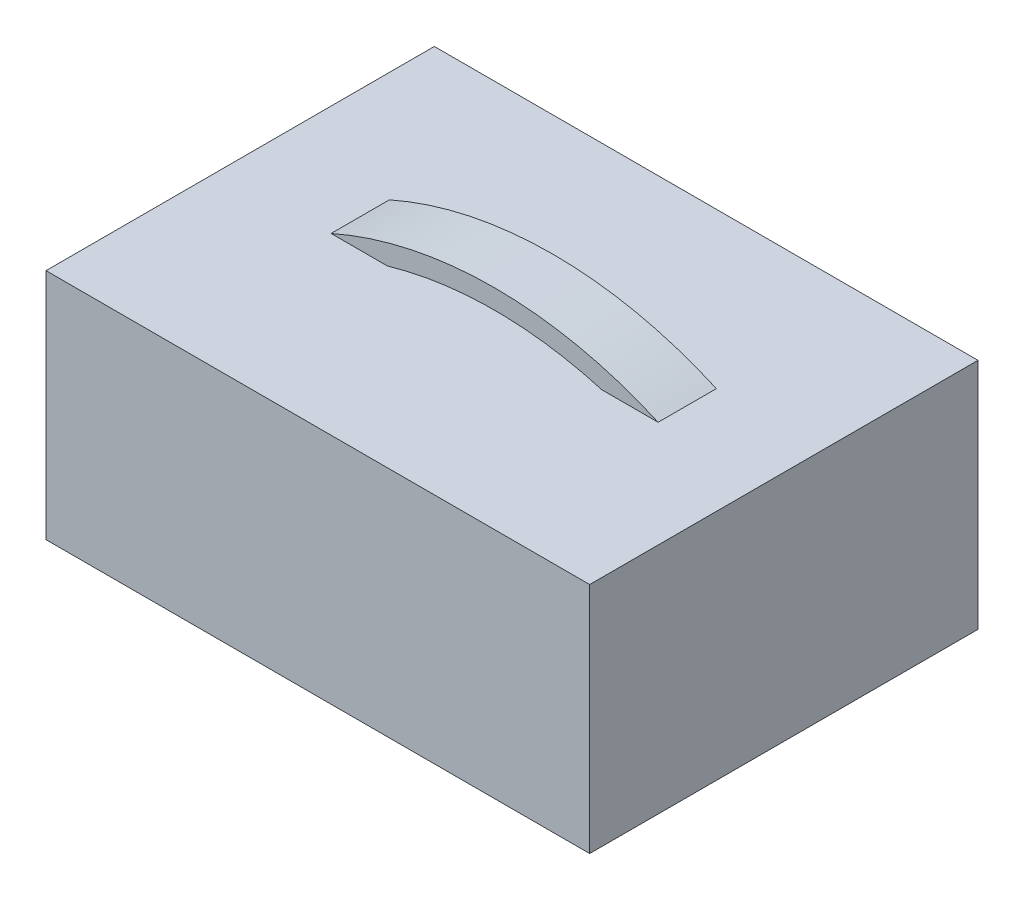
ISO-10303-21;
HEADER;
FILE_DESCRIPTION(('STEP AP214'),'2;1');
FILE_NAME('part.step','',(''),(''),'','','');
FILE_SCHEMA(('AUTOMOTIVE_DESIGN { 1 0 10303 214 1 1 1 1 }'));
ENDSEC;
DATA;
#1=APPLICATION_CONTEXT('core data for automotive mechanical design processes');
#2=APPLICATION_PROTOCOL_DEFINITION('international standard','automotive_design',2000,#1);
#3=PRODUCT_CONTEXT('',#1,'mechanical');
#4=PRODUCT('Part','Part','',(#3));
#5=PRODUCT_RELATED_PRODUCT_CATEGORY('part','',(#4));
#6=PRODUCT_DEFINITION_FORMATION('','',#4);
#7=PRODUCT_DEFINITION_CONTEXT('part definition',#1,'design');
#8=PRODUCT_DEFINITION('design','',#6,#7);
#9=PRODUCT_DEFINITION_SHAPE('','',#8);
#10=(LENGTH_UNIT() NAMED_UNIT(*) SI_UNIT(.MILLI.,.METRE.));
#11=(NAMED_UNIT(*) PLANE_ANGLE_UNIT() SI_UNIT($,.RADIAN.));
#12=(NAMED_UNIT(*) SI_UNIT($,.STERADIAN.) SOLID_ANGLE_UNIT());
#13=UNCERTAINTY_MEASURE_WITH_UNIT(LENGTH_MEASURE(1.E-05),#10,'distance_accuracy_value','');
#14=(GEOMETRIC_REPRESENTATION_CONTEXT(3) GLOBAL_UNCERTAINTY_ASSIGNED_CONTEXT((#13)) GLOBAL_UNIT_ASSIGNED_CONTEXT((#10,
#11,#12)) REPRESENTATION_CONTEXT('',''));
#15=CARTESIAN_POINT('',(0.,0.,0.));
#16=DIRECTION('',(0.,0.,1.));
#17=DIRECTION('',(1.,0.,0.));
#18=AXIS2_PLACEMENT_3D('',#15,#16,#17);
#19=CARTESIAN_POINT('',(0.,120.,0.));
#20=DIRECTION('',(0.,-1.,0.));
#21=DIRECTION('',(0.,0.,-1.));
#22=AXIS2_PLACEMENT_3D('',#19,#20,#21);
#23=PLANE('',#22);
#24=DIRECTION('',(-1.,0.,0.));
#25=VECTOR('',#24,1.);
#26=CARTESIAN_POINT('',(0.,120.,-120.));
#27=LINE('',#26,#25);
#28=CARTESIAN_POINT('',(85.865413905169,120.,-120.));
#29=VERTEX_POINT('',#28);
#30=CARTESIAN_POINT('',(56.8404748659782,120.,-120.));
#31=VERTEX_POINT('',#30);
#32=EDGE_CURVE('E42',#29,#31,#27,.T.);
#33=ORIENTED_EDGE('',*,*,#32,.F.);
#34=DIRECTION('',(0.,0.,1.));
#35=VECTOR('',#34,1.);
#36=CARTESIAN_POINT('',(85.865413905169,120.,-120.));
#37=LINE('',#36,#35);
#38=CARTESIAN_POINT('',(85.865413905169,120.,-90.));
#39=VERTEX_POINT('',#38);
#40=EDGE_CURVE('E119',#29,#39,#37,.T.);
#41=ORIENTED_EDGE('',*,*,#40,.T.);
#42=DIRECTION('',(-1.,0.,0.));
#43=VECTOR('',#42,1.);
#44=CARTESIAN_POINT('',(0.,120.,-90.));
#45=LINE('',#44,#43);
#46=CARTESIAN_POINT('',(56.8404748659782,120.,-90.));
#47=VERTEX_POINT('',#46);
#48=EDGE_CURVE('E118',#39,#47,#45,.T.);
#49=ORIENTED_EDGE('',*,*,#48,.T.);
#50=DIRECTION('',(0.,0.,1.));
#51=VECTOR('',#50,1.);
#52=CARTESIAN_POINT('',(56.8404748659782,120.,-120.));
#53=LINE('',#52,#51);
#54=EDGE_CURVE('E112',#31,#47,#53,.T.);
#55=ORIENTED_EDGE('',*,*,#54,.F.);
#56=EDGE_LOOP('',(#33,#41,#49,#55));
#57=FACE_BOUND('',#56,.T.);
#58=DIRECTION('',(0.,0.,1.));
#59=VECTOR('',#58,1.);
#60=CARTESIAN_POINT('',(0.,120.,0.));
#61=LINE('',#60,#59);
#62=CARTESIAN_POINT('',(0.,120.,-200.));
#63=VERTEX_POINT('',#62);
#64=CARTESIAN_POINT('',(0.,120.,0.));
#65=VERTEX_POINT('',#64);
#66=EDGE_CURVE('E143',#63,#65,#61,.T.);
#67=ORIENTED_EDGE('',*,*,#66,.T.);
#68=DIRECTION('',(1.,0.,0.));
#69=VECTOR('',#68,1.);
#70=CARTESIAN_POINT('',(0.,120.,0.));
#71=LINE('',#70,#69);
#72=CARTESIAN_POINT('',(280.,120.,0.));
#73=VERTEX_POINT('',#72);
#74=EDGE_CURVE('E153',#65,#73,#71,.T.);
#75=ORIENTED_EDGE('',*,*,#74,.T.);
#76=DIRECTION('',(0.,0.,-1.));
#77=VECTOR('',#76,1.);
#78=CARTESIAN_POINT('',(280.,120.,0.));
#79=LINE('',#78,#77);
#80=CARTESIAN_POINT('',(280.,120.,-200.));
#81=VERTEX_POINT('',#80);
#82=EDGE_CURVE('E151',#73,#81,#79,.T.);
#83=ORIENTED_EDGE('',*,*,#82,.T.);
#84=DIRECTION('',(-1.,0.,0.));
#85=VECTOR('',#84,1.);
#86=CARTESIAN_POINT('',(0.,120.,-200.));
#87=LINE('',#86,#85);
#88=EDGE_CURVE('E140',#81,#63,#87,.T.);
#89=ORIENTED_EDGE('',*,*,#88,.T.);
#90=EDGE_LOOP('',(#67,#75,#83,#89));
#91=FACE_BOUND('',#90,.T.);
#92=CARTESIAN_POINT('',(225.25719537895,120.,-120.));
#93=VERTEX_POINT('',#92);
#94=CARTESIAN_POINT('',(196.232256339759,120.,-120.));
#95=VERTEX_POINT('',#94);
#96=EDGE_CURVE('E11',#93,#95,#27,.T.);
#97=ORIENTED_EDGE('',*,*,#96,.F.);
#98=DIRECTION('',(0.,0.,1.));
#99=VECTOR('',#98,1.);
#100=CARTESIAN_POINT('',(225.25719537895,120.,-120.));
#101=LINE('',#100,#99);
#102=CARTESIAN_POINT('',(225.25719537895,120.,-90.));
#103=VERTEX_POINT('',#102);
#104=EDGE_CURVE('E105',#93,#103,#101,.T.);
#105=ORIENTED_EDGE('',*,*,#104,.T.);
#106=CARTESIAN_POINT('',(196.232256339759,120.,-90.));
#107=VERTEX_POINT('',#106);
#108=EDGE_CURVE('E115',#103,#107,#45,.T.);
#109=ORIENTED_EDGE('',*,*,#108,.T.);
#110=DIRECTION('',(0.,0.,1.));
#111=VECTOR('',#110,1.);
#112=CARTESIAN_POINT('',(196.232256339759,120.,-120.));
#113=LINE('',#112,#111);
#114=EDGE_CURVE('E37',#107,#95,#113,.F.);
#115=ORIENTED_EDGE('',*,*,#114,.T.);
#116=EDGE_LOOP('',(#97,#105,#109,#115));
#117=FACE_BOUND('',#116,.T.);
#118=ADVANCED_FACE('F33',(#57,#91,#117),#23,.F.);
#119=CARTESIAN_POINT('',(0.,120.,0.));
#120=DIRECTION('',(1.,0.,0.));
#121=DIRECTION('',(0.,0.,-1.));
#122=AXIS2_PLACEMENT_3D('',#119,#120,#121);
#123=PLANE('',#122);
#124=DIRECTION('',(0.,0.,1.));
#125=VECTOR('',#124,1.);
#126=CARTESIAN_POINT('',(0.,0.,0.));
#127=LINE('',#126,#125);
#128=CARTESIAN_POINT('',(0.,0.,-200.));
#129=VERTEX_POINT('',#128);
#130=CARTESIAN_POINT('',(0.,0.,0.));
#131=VERTEX_POINT('',#130);
#132=EDGE_CURVE('E148',#129,#131,#127,.T.);
#133=ORIENTED_EDGE('',*,*,#132,.T.);
#134=DIRECTION('',(0.,-1.,0.));
#135=VECTOR('',#134,1.);
#136=CARTESIAN_POINT('',(0.,120.,0.));
#137=LINE('',#136,#135);
#138=EDGE_CURVE('E123',#65,#131,#137,.T.);
#139=ORIENTED_EDGE('',*,*,#138,.F.);
#140=ORIENTED_EDGE('',*,*,#66,.F.);
#141=DIRECTION('',(0.,-1.,0.));
#142=VECTOR('',#141,1.);
#143=CARTESIAN_POINT('',(0.,120.,-200.));
#144=LINE('',#143,#142);
#145=EDGE_CURVE('E137',#63,#129,#144,.T.);
#146=ORIENTED_EDGE('',*,*,#145,.T.);
#147=EDGE_LOOP('',(#133,#139,#140,#146));
#148=FACE_BOUND('',#147,.T.);
#149=ADVANCED_FACE('F35',(#148),#123,.F.);
#150=CARTESIAN_POINT('',(0.,120.,0.));
#151=DIRECTION('',(0.,0.,-1.));
#152=DIRECTION('',(-1.,0.,0.));
#153=AXIS2_PLACEMENT_3D('',#150,#151,#152);
#154=PLANE('',#153);
#155=DIRECTION('',(1.,0.,0.));
#156=VECTOR('',#155,1.);
#157=CARTESIAN_POINT('',(0.,0.,0.));
#158=LINE('',#157,#156);
#159=CARTESIAN_POINT('',(280.,0.,0.));
#160=VERTEX_POINT('',#159);
#161=EDGE_CURVE('E146',#131,#160,#158,.T.);
#162=ORIENTED_EDGE('',*,*,#161,.T.);
#163=DIRECTION('',(0.,-1.,0.));
#164=VECTOR('',#163,1.);
#165=CARTESIAN_POINT('',(280.,120.,0.));
#166=LINE('',#165,#164);
#167=EDGE_CURVE('E127',#73,#160,#166,.T.);
#168=ORIENTED_EDGE('',*,*,#167,.F.);
#169=ORIENTED_EDGE('',*,*,#74,.F.);
#170=ORIENTED_EDGE('',*,*,#138,.T.);
#171=EDGE_LOOP('',(#162,#168,#169,#170));
#172=FACE_BOUND('',#171,.T.);
#173=ADVANCED_FACE('F174',(#172),#154,.F.);
#174=CARTESIAN_POINT('',(280.,120.,0.));
#175=DIRECTION('',(-1.,0.,0.));
#176=DIRECTION('',(0.,0.,1.));
#177=AXIS2_PLACEMENT_3D('',#174,#175,#176);
#178=PLANE('',#177);
#179=DIRECTION('',(0.,0.,-1.));
#180=VECTOR('',#179,1.);
#181=CARTESIAN_POINT('',(280.,0.,0.));
#182=LINE('',#181,#180);
#183=CARTESIAN_POINT('',(280.,0.,-200.));
#184=VERTEX_POINT('',#183);
#185=EDGE_CURVE('E144',#160,#184,#182,.T.);
#186=ORIENTED_EDGE('',*,*,#185,.T.);
#187=DIRECTION('',(0.,-1.,0.));
#188=VECTOR('',#187,1.);
#189=CARTESIAN_POINT('',(280.,120.,-200.));
#190=LINE('',#189,#188);
#191=EDGE_CURVE('E132',#81,#184,#190,.T.);
#192=ORIENTED_EDGE('',*,*,#191,.F.);
#193=ORIENTED_EDGE('',*,*,#82,.F.);
#194=ORIENTED_EDGE('',*,*,#167,.T.);
#195=EDGE_LOOP('',(#186,#192,#193,#194));
#196=FACE_BOUND('',#195,.T.);
#197=ADVANCED_FACE('F177',(#196),#178,.F.);
#198=CARTESIAN_POINT('',(0.,120.,-200.));
#199=DIRECTION('',(0.,0.,1.));
#200=DIRECTION('',(1.,0.,0.));
#201=AXIS2_PLACEMENT_3D('',#198,#199,#200);
#202=PLANE('',#201);
#203=DIRECTION('',(-1.,0.,0.));
#204=VECTOR('',#203,1.);
#205=CARTESIAN_POINT('',(0.,0.,-200.));
#206=LINE('',#205,#204);
#207=EDGE_CURVE('E141',#184,#129,#206,.T.);
#208=ORIENTED_EDGE('',*,*,#207,.T.);
#209=ORIENTED_EDGE('',*,*,#145,.F.);
#210=ORIENTED_EDGE('',*,*,#88,.F.);
#211=ORIENTED_EDGE('',*,*,#191,.T.);
#212=EDGE_LOOP('',(#208,#209,#210,#211));
#213=FACE_BOUND('',#212,.T.);
#214=ADVANCED_FACE('F180',(#213),#202,.F.);
#215=CARTESIAN_POINT('',(0.,0.,0.));
#216=DIRECTION('',(0.,-1.,0.));
#217=DIRECTION('',(0.,0.,-1.));
#218=AXIS2_PLACEMENT_3D('',#215,#216,#217);
#219=PLANE('',#218);
#220=ORIENTED_EDGE('',*,*,#132,.F.);
#221=ORIENTED_EDGE('',*,*,#207,.F.);
#222=ORIENTED_EDGE('',*,*,#185,.F.);
#223=ORIENTED_EDGE('',*,*,#161,.F.);
#224=EDGE_LOOP('',(#220,#221,#222,#223));
#225=FACE_BOUND('',#224,.T.);
#226=ADVANCED_FACE('F172',(#225),#219,.T.);
#227=CARTESIAN_POINT('',(141.048835122464,-69.4172194813717,-120.));
#228=DIRECTION('',(0.,0.,1.));
#229=DIRECTION('',(1.,0.,0.));
#230=AXIS2_PLACEMENT_3D('',#227,#228,#229);
#231=CYLINDRICAL_SURFACE('',#230,197.291897992035);
#232=ORIENTED_EDGE('',*,*,#114,.F.);
#233=CARTESIAN_POINT('',(141.048835122464,-69.4172194813717,-90.));
#234=DIRECTION('',(0.,0.,1.));
#235=DIRECTION('',(1.,0.,0.));
#236=AXIS2_PLACEMENT_3D('',#233,#234,#235);
#237=CIRCLE('',#236,197.291897992035);
#238=EDGE_CURVE('E49',#39,#107,#237,.F.);
#239=ORIENTED_EDGE('',*,*,#238,.F.);
#240=ORIENTED_EDGE('',*,*,#40,.F.);
#241=CARTESIAN_POINT('',(141.048835122464,-69.4172194813717,-120.));
#242=DIRECTION('',(0.,0.,1.));
#243=DIRECTION('',(1.,0.,0.));
#244=AXIS2_PLACEMENT_3D('',#241,#242,#243);
#245=CIRCLE('',#244,197.291897992035);
#246=EDGE_CURVE('E106',#29,#95,#245,.F.);
#247=ORIENTED_EDGE('',*,*,#246,.T.);
#248=EDGE_LOOP('',(#232,#239,#240,#247));
#249=FACE_BOUND('',#248,.T.);
#250=ADVANCED_FACE('F160',(#249),#231,.F.);
#251=CARTESIAN_POINT('',(141.048835122464,-69.4172194813717,-120.));
#252=DIRECTION('',(0.,0.,1.));
#253=DIRECTION('',(1.,0.,0.));
#254=AXIS2_PLACEMENT_3D('',#251,#252,#253);
#255=PLANE('',#254);
#256=CARTESIAN_POINT('',(141.048835122464,-69.4172194813717,-120.));
#257=DIRECTION('',(0.,0.,-1.));
#258=DIRECTION('',(-1.,0.,0.));
#259=AXIS2_PLACEMENT_3D('',#256,#257,#258);
#260=CIRCLE('',#259,207.291897992035);
#261=EDGE_CURVE('E96',#31,#93,#260,.T.);
#262=ORIENTED_EDGE('',*,*,#261,.T.);
#263=ORIENTED_EDGE('',*,*,#96,.T.);
#264=ORIENTED_EDGE('',*,*,#246,.F.);
#265=ORIENTED_EDGE('',*,*,#32,.T.);
#266=EDGE_LOOP('',(#262,#263,#264,#265));
#267=FACE_BOUND('',#266,.T.);
#268=ADVANCED_FACE('F98',(#267),#255,.F.);
#269=CARTESIAN_POINT('',(141.048835122464,-69.4172194813717,-90.));
#270=DIRECTION('',(0.,0.,1.));
#271=DIRECTION('',(1.,0.,0.));
#272=AXIS2_PLACEMENT_3D('',#269,#270,#271);
#273=PLANE('',#272);
#274=ORIENTED_EDGE('',*,*,#108,.F.);
#275=CARTESIAN_POINT('',(141.048835122464,-69.4172194813717,-90.));
#276=DIRECTION('',(0.,0.,-1.));
#277=DIRECTION('',(-1.,0.,0.));
#278=AXIS2_PLACEMENT_3D('',#275,#276,#277);
#279=CIRCLE('',#278,207.291897992035);
#280=EDGE_CURVE('E54',#47,#103,#279,.T.);
#281=ORIENTED_EDGE('',*,*,#280,.F.);
#282=ORIENTED_EDGE('',*,*,#48,.F.);
#283=ORIENTED_EDGE('',*,*,#238,.T.);
#284=EDGE_LOOP('',(#274,#281,#282,#283));
#285=FACE_BOUND('',#284,.T.);
#286=ADVANCED_FACE('F219',(#285),#273,.T.);
#287=CARTESIAN_POINT('',(141.048835122464,-69.4172194813717,-120.));
#288=DIRECTION('',(0.,0.,1.));
#289=DIRECTION('',(1.,0.,0.));
#290=AXIS2_PLACEMENT_3D('',#287,#288,#289);
#291=CYLINDRICAL_SURFACE('',#290,207.291897992035);
#292=ORIENTED_EDGE('',*,*,#280,.T.);
#293=ORIENTED_EDGE('',*,*,#104,.F.);
#294=ORIENTED_EDGE('',*,*,#261,.F.);
#295=ORIENTED_EDGE('',*,*,#54,.T.);
#296=EDGE_LOOP('',(#292,#293,#294,#295));
#297=FACE_BOUND('',#296,.T.);
#298=ADVANCED_FACE('F109',(#297),#291,.T.);
#299=CLOSED_SHELL('',(#118,#149,#173,#197,#214,#226,#250,#268,#286,#298));
#300=MANIFOLD_SOLID_BREP('B2',#299);
#301=ADVANCED_BREP_SHAPE_REPRESENTATION('',(#18,#300),#14);
#302=SHAPE_DEFINITION_REPRESENTATION(#9,#301);
ENDSEC;
END-ISO-10303-21;
